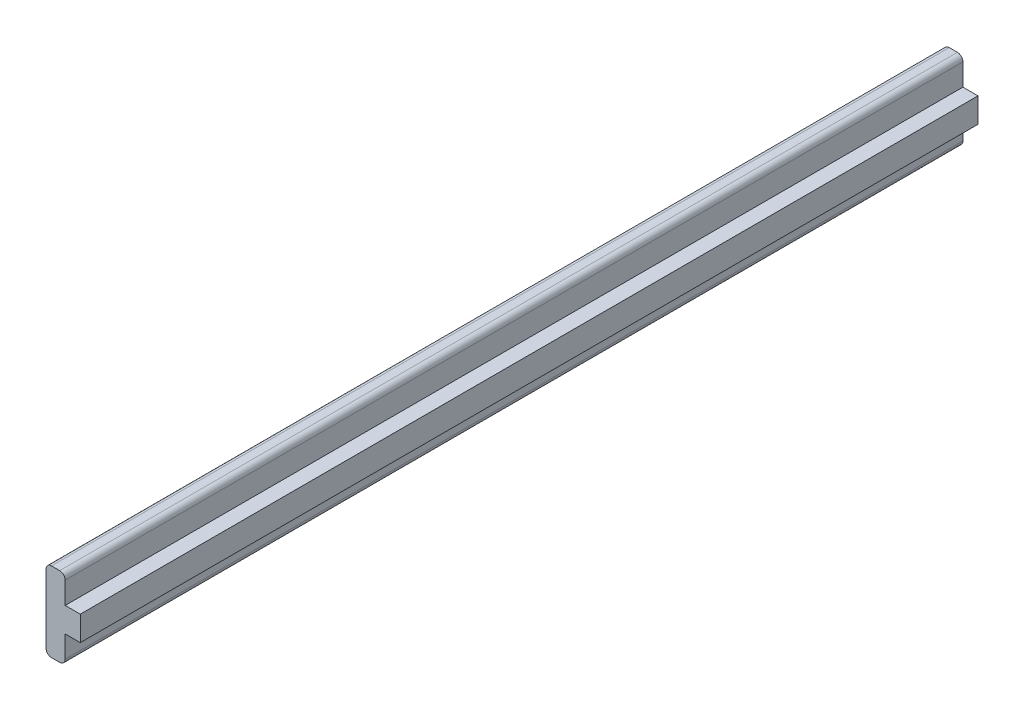
ISO-10303-21;
HEADER;
FILE_DESCRIPTION(('STEP AP214'),'2;1');
FILE_NAME('part.step','',(''),(''),'','','');
FILE_SCHEMA(('AUTOMOTIVE_DESIGN { 1 0 10303 214 1 1 1 1 }'));
ENDSEC;
DATA;
#1=APPLICATION_CONTEXT('core data for automotive mechanical design processes');
#2=APPLICATION_PROTOCOL_DEFINITION('international standard','automotive_design',2000,#1);
#3=PRODUCT_CONTEXT('',#1,'mechanical');
#4=PRODUCT('Part','Part','',(#3));
#5=PRODUCT_RELATED_PRODUCT_CATEGORY('part','',(#4));
#6=PRODUCT_DEFINITION_FORMATION('','',#4);
#7=PRODUCT_DEFINITION_CONTEXT('part definition',#1,'design');
#8=PRODUCT_DEFINITION('design','',#6,#7);
#9=PRODUCT_DEFINITION_SHAPE('','',#8);
#10=(LENGTH_UNIT() NAMED_UNIT(*) SI_UNIT(.MILLI.,.METRE.));
#11=(NAMED_UNIT(*) PLANE_ANGLE_UNIT() SI_UNIT($,.RADIAN.));
#12=(NAMED_UNIT(*) SI_UNIT($,.STERADIAN.) SOLID_ANGLE_UNIT());
#13=UNCERTAINTY_MEASURE_WITH_UNIT(LENGTH_MEASURE(1.E-05),#10,'distance_accuracy_value','');
#14=(GEOMETRIC_REPRESENTATION_CONTEXT(3) GLOBAL_UNCERTAINTY_ASSIGNED_CONTEXT((#13)) GLOBAL_UNIT_ASSIGNED_CONTEXT((#10,
#11,#12)) REPRESENTATION_CONTEXT('',''));
#15=CARTESIAN_POINT('',(0.,0.,0.));
#16=DIRECTION('',(0.,0.,1.));
#17=DIRECTION('',(1.,0.,0.));
#18=AXIS2_PLACEMENT_3D('',#15,#16,#17);
#19=CARTESIAN_POINT('',(-1.5,-4.,21.));
#20=DIRECTION('',(1.,0.,0.));
#21=DIRECTION('',(0.,0.,-1.));
#22=AXIS2_PLACEMENT_3D('',#19,#20,#21);
#23=PLANE('',#22);
#24=DIRECTION('',(0.,-1.,0.));
#25=VECTOR('',#24,1.);
#26=CARTESIAN_POINT('',(-1.5,-4.,16.5));
#27=LINE('',#26,#25);
#28=CARTESIAN_POINT('',(-1.5,1.5,16.5));
#29=VERTEX_POINT('',#28);
#30=CARTESIAN_POINT('',(-1.5,-3.5,16.5));
#31=VERTEX_POINT('',#30);
#32=EDGE_CURVE('E160',#29,#31,#27,.T.);
#33=ORIENTED_EDGE('',*,*,#32,.F.);
#34=DIRECTION('',(0.,0.,1.));
#35=VECTOR('',#34,1.);
#36=CARTESIAN_POINT('',(-1.5,1.5,21.));
#37=LINE('',#36,#35);
#38=CARTESIAN_POINT('',(-1.5,1.5,-49.));
#39=VERTEX_POINT('',#38);
#40=EDGE_CURVE('E195',#29,#39,#37,.F.);
#41=ORIENTED_EDGE('',*,*,#40,.T.);
#42=DIRECTION('',(0.,1.,0.));
#43=VECTOR('',#42,1.);
#44=CARTESIAN_POINT('',(-1.5,-3.9,-49.));
#45=LINE('',#44,#43);
#46=CARTESIAN_POINT('',(-1.5,-3.5,-49.));
#47=VERTEX_POINT('',#46);
#48=EDGE_CURVE('E175',#47,#39,#45,.T.);
#49=ORIENTED_EDGE('',*,*,#48,.F.);
#50=DIRECTION('',(0.,0.,1.));
#51=VECTOR('',#50,1.);
#52=CARTESIAN_POINT('',(-1.5,-3.5,21.));
#53=LINE('',#52,#51);
#54=EDGE_CURVE('E192',#47,#31,#53,.T.);
#55=ORIENTED_EDGE('',*,*,#54,.T.);
#56=EDGE_LOOP('',(#33,#41,#49,#55));
#57=FACE_BOUND('',#56,.T.);
#58=ADVANCED_FACE('F39',(#57),#23,.F.);
#59=CARTESIAN_POINT('',(-1.5,-3.9,0.));
#60=DIRECTION('',(0.,1.,0.));
#61=DIRECTION('',(0.,0.,1.));
#62=AXIS2_PLACEMENT_3D('',#59,#60,#61);
#63=PLANE('',#62);
#64=DIRECTION('',(1.,0.,0.));
#65=VECTOR('',#64,1.);
#66=CARTESIAN_POINT('',(-1.5,-3.9,16.5));
#67=LINE('',#66,#65);
#68=CARTESIAN_POINT('',(-1.1,-3.9,16.5));
#69=VERTEX_POINT('',#68);
#70=CARTESIAN_POINT('',(-0.5,-3.9,16.5));
#71=VERTEX_POINT('',#70);
#72=EDGE_CURVE('E158',#69,#71,#67,.T.);
#73=ORIENTED_EDGE('',*,*,#72,.F.);
#74=DIRECTION('',(0.,0.,1.));
#75=VECTOR('',#74,1.);
#76=CARTESIAN_POINT('',(-1.1,-3.9,0.));
#77=LINE('',#76,#75);
#78=CARTESIAN_POINT('',(-1.1,-3.9,-49.));
#79=VERTEX_POINT('',#78);
#80=EDGE_CURVE('E210',#69,#79,#77,.F.);
#81=ORIENTED_EDGE('',*,*,#80,.T.);
#82=DIRECTION('',(-1.,0.,0.));
#83=VECTOR('',#82,1.);
#84=CARTESIAN_POINT('',(-0.1,-3.9,-49.));
#85=LINE('',#84,#83);
#86=CARTESIAN_POINT('',(-0.5,-3.9,-49.));
#87=VERTEX_POINT('',#86);
#88=EDGE_CURVE('E172',#87,#79,#85,.T.);
#89=ORIENTED_EDGE('',*,*,#88,.F.);
#90=DIRECTION('',(0.,0.,1.));
#91=VECTOR('',#90,1.);
#92=CARTESIAN_POINT('',(-0.5,-3.9,0.));
#93=LINE('',#92,#91);
#94=EDGE_CURVE('E207',#87,#71,#93,.T.);
#95=ORIENTED_EDGE('',*,*,#94,.T.);
#96=EDGE_LOOP('',(#73,#81,#89,#95));
#97=FACE_BOUND('',#96,.T.);
#98=ADVANCED_FACE('F222',(#97),#63,.F.);
#99=CARTESIAN_POINT('',(-0.1,-3.9,0.));
#100=DIRECTION('',(-1.,0.,0.));
#101=DIRECTION('',(0.,-1.,0.));
#102=AXIS2_PLACEMENT_3D('',#99,#100,#101);
#103=PLANE('',#102);
#104=DIRECTION('',(0.,1.,0.));
#105=VECTOR('',#104,1.);
#106=CARTESIAN_POINT('',(-0.1,-3.9,16.5));
#107=LINE('',#106,#105);
#108=CARTESIAN_POINT('',(-0.1,-3.5,16.5));
#109=VERTEX_POINT('',#108);
#110=CARTESIAN_POINT('',(-0.0999999999999998,-1.9,16.5));
#111=VERTEX_POINT('',#110);
#112=EDGE_CURVE('E144',#109,#111,#107,.T.);
#113=ORIENTED_EDGE('',*,*,#112,.F.);
#114=DIRECTION('',(0.,0.,1.));
#115=VECTOR('',#114,1.);
#116=CARTESIAN_POINT('',(-0.1,-3.5,0.));
#117=LINE('',#116,#115);
#118=CARTESIAN_POINT('',(-0.1,-3.5,-49.));
#119=VERTEX_POINT('',#118);
#120=EDGE_CURVE('E47',#109,#119,#117,.F.);
#121=ORIENTED_EDGE('',*,*,#120,.T.);
#122=DIRECTION('',(0.,-1.,0.));
#123=VECTOR('',#122,1.);
#124=CARTESIAN_POINT('',(-0.0999999999999998,-1.9,-49.));
#125=LINE('',#124,#123);
#126=CARTESIAN_POINT('',(-0.0999999999999998,-1.9,-49.));
#127=VERTEX_POINT('',#126);
#128=EDGE_CURVE('E169',#127,#119,#125,.T.);
#129=ORIENTED_EDGE('',*,*,#128,.F.);
#130=DIRECTION('',(0.,0.,1.));
#131=VECTOR('',#130,1.);
#132=CARTESIAN_POINT('',(-0.0999999999999998,-1.9,0.));
#133=LINE('',#132,#131);
#134=EDGE_CURVE('E182',#127,#111,#133,.T.);
#135=ORIENTED_EDGE('',*,*,#134,.T.);
#136=EDGE_LOOP('',(#113,#121,#129,#135));
#137=FACE_BOUND('',#136,.T.);
#138=ADVANCED_FACE('F214',(#137),#103,.F.);
#139=CARTESIAN_POINT('',(-0.0999999999999998,-1.9,0.));
#140=DIRECTION('',(0.,1.,0.));
#141=DIRECTION('',(0.,0.,1.));
#142=AXIS2_PLACEMENT_3D('',#139,#140,#141);
#143=PLANE('',#142);
#144=DIRECTION('',(-1.,0.,0.));
#145=VECTOR('',#144,1.);
#146=CARTESIAN_POINT('',(2.1,-1.9,-49.));
#147=LINE('',#146,#145);
#148=CARTESIAN_POINT('',(1.,-1.9,-49.));
#149=VERTEX_POINT('',#148);
#150=EDGE_CURVE('E139',#149,#127,#147,.T.);
#151=ORIENTED_EDGE('',*,*,#150,.F.);
#152=DIRECTION('',(0.,0.,1.));
#153=VECTOR('',#152,1.);
#154=CARTESIAN_POINT('',(1.,-1.9,0.));
#155=LINE('',#154,#153);
#156=CARTESIAN_POINT('',(1.,-1.9,16.5));
#157=VERTEX_POINT('',#156);
#158=EDGE_CURVE('E127',#149,#157,#155,.T.);
#159=ORIENTED_EDGE('',*,*,#158,.T.);
#160=DIRECTION('',(1.,0.,0.));
#161=VECTOR('',#160,1.);
#162=CARTESIAN_POINT('',(-0.0999999999999998,-1.9,16.5));
#163=LINE('',#162,#161);
#164=EDGE_CURVE('E137',#111,#157,#163,.T.);
#165=ORIENTED_EDGE('',*,*,#164,.F.);
#166=ORIENTED_EDGE('',*,*,#134,.F.);
#167=EDGE_LOOP('',(#151,#159,#165,#166));
#168=FACE_BOUND('',#167,.T.);
#169=ADVANCED_FACE('F135',(#168),#143,.F.);
#170=CARTESIAN_POINT('',(-0.0999999999999998,-0.1,0.));
#171=DIRECTION('',(0.,-1.,0.));
#172=DIRECTION('',(0.,0.,-1.));
#173=AXIS2_PLACEMENT_3D('',#170,#171,#172);
#174=PLANE('',#173);
#175=DIRECTION('',(-1.,0.,0.));
#176=VECTOR('',#175,1.);
#177=CARTESIAN_POINT('',(-0.0999999999999998,-0.1,16.5));
#178=LINE('',#177,#176);
#179=CARTESIAN_POINT('',(1.,-0.1,16.5));
#180=VERTEX_POINT('',#179);
#181=CARTESIAN_POINT('',(-0.0999999999999998,-0.1,16.5));
#182=VERTEX_POINT('',#181);
#183=EDGE_CURVE('E140',#180,#182,#178,.T.);
#184=ORIENTED_EDGE('',*,*,#183,.F.);
#185=DIRECTION('',(0.,0.,-1.));
#186=VECTOR('',#185,1.);
#187=CARTESIAN_POINT('',(1.,-0.1,0.));
#188=LINE('',#187,#186);
#189=CARTESIAN_POINT('',(1.,-0.1,-49.));
#190=VERTEX_POINT('',#189);
#191=EDGE_CURVE('E53',#180,#190,#188,.T.);
#192=ORIENTED_EDGE('',*,*,#191,.T.);
#193=DIRECTION('',(1.,0.,0.));
#194=VECTOR('',#193,1.);
#195=CARTESIAN_POINT('',(-0.0999999999999998,-0.1,-49.));
#196=LINE('',#195,#194);
#197=CARTESIAN_POINT('',(-0.0999999999999998,-0.1,-49.));
#198=VERTEX_POINT('',#197);
#199=EDGE_CURVE('E165',#198,#190,#196,.T.);
#200=ORIENTED_EDGE('',*,*,#199,.F.);
#201=DIRECTION('',(0.,0.,1.));
#202=VECTOR('',#201,1.);
#203=CARTESIAN_POINT('',(-0.0999999999999998,-0.1,0.));
#204=LINE('',#203,#202);
#205=EDGE_CURVE('E183',#198,#182,#204,.T.);
#206=ORIENTED_EDGE('',*,*,#205,.T.);
#207=EDGE_LOOP('',(#184,#192,#200,#206));
#208=FACE_BOUND('',#207,.T.);
#209=ADVANCED_FACE('F253',(#208),#174,.F.);
#210=CARTESIAN_POINT('',(-0.1,1.9,0.));
#211=DIRECTION('',(-1.,0.,0.));
#212=DIRECTION('',(0.,-1.,0.));
#213=AXIS2_PLACEMENT_3D('',#210,#211,#212);
#214=PLANE('',#213);
#215=DIRECTION('',(0.,1.,0.));
#216=VECTOR('',#215,1.);
#217=CARTESIAN_POINT('',(-0.1,1.9,16.5));
#218=LINE('',#217,#216);
#219=CARTESIAN_POINT('',(-0.1,1.5,16.5));
#220=VERTEX_POINT('',#219);
#221=EDGE_CURVE('E249',#182,#220,#218,.T.);
#222=ORIENTED_EDGE('',*,*,#221,.F.);
#223=ORIENTED_EDGE('',*,*,#205,.F.);
#224=DIRECTION('',(0.,-1.,0.));
#225=VECTOR('',#224,1.);
#226=CARTESIAN_POINT('',(-0.1,1.9,-49.));
#227=LINE('',#226,#225);
#228=CARTESIAN_POINT('',(-0.1,1.5,-49.));
#229=VERTEX_POINT('',#228);
#230=EDGE_CURVE('E180',#229,#198,#227,.T.);
#231=ORIENTED_EDGE('',*,*,#230,.F.);
#232=DIRECTION('',(0.,0.,1.));
#233=VECTOR('',#232,1.);
#234=CARTESIAN_POINT('',(-0.1,1.5,0.));
#235=LINE('',#234,#233);
#236=EDGE_CURVE('E204',#229,#220,#235,.T.);
#237=ORIENTED_EDGE('',*,*,#236,.T.);
#238=EDGE_LOOP('',(#222,#223,#231,#237));
#239=FACE_BOUND('',#238,.T.);
#240=ADVANCED_FACE('F247',(#239),#214,.F.);
#241=CARTESIAN_POINT('',(-1.5,1.9,0.));
#242=DIRECTION('',(0.,-1.,0.));
#243=DIRECTION('',(0.,0.,-1.));
#244=AXIS2_PLACEMENT_3D('',#241,#242,#243);
#245=PLANE('',#244);
#246=DIRECTION('',(-1.,0.,0.));
#247=VECTOR('',#246,1.);
#248=CARTESIAN_POINT('',(-1.5,1.9,16.5));
#249=LINE('',#248,#247);
#250=CARTESIAN_POINT('',(-0.5,1.9,16.5));
#251=VERTEX_POINT('',#250);
#252=CARTESIAN_POINT('',(-1.1,1.9,16.5));
#253=VERTEX_POINT('',#252);
#254=EDGE_CURVE('E145',#251,#253,#249,.T.);
#255=ORIENTED_EDGE('',*,*,#254,.F.);
#256=DIRECTION('',(0.,0.,1.));
#257=VECTOR('',#256,1.);
#258=CARTESIAN_POINT('',(-0.5,1.9,0.));
#259=LINE('',#258,#257);
#260=CARTESIAN_POINT('',(-0.5,1.9,-49.));
#261=VERTEX_POINT('',#260);
#262=EDGE_CURVE('E186',#251,#261,#259,.F.);
#263=ORIENTED_EDGE('',*,*,#262,.T.);
#264=DIRECTION('',(1.,0.,0.));
#265=VECTOR('',#264,1.);
#266=CARTESIAN_POINT('',(-1.5,1.9,-49.));
#267=LINE('',#266,#265);
#268=CARTESIAN_POINT('',(-1.1,1.9,-49.));
#269=VERTEX_POINT('',#268);
#270=EDGE_CURVE('E178',#269,#261,#267,.T.);
#271=ORIENTED_EDGE('',*,*,#270,.F.);
#272=DIRECTION('',(0.,0.,1.));
#273=VECTOR('',#272,1.);
#274=CARTESIAN_POINT('',(-1.1,1.9,0.));
#275=LINE('',#274,#273);
#276=EDGE_CURVE('E189',#269,#253,#275,.T.);
#277=ORIENTED_EDGE('',*,*,#276,.T.);
#278=EDGE_LOOP('',(#255,#263,#271,#277));
#279=FACE_BOUND('',#278,.T.);
#280=ADVANCED_FACE('F239',(#279),#245,.F.);
#281=CARTESIAN_POINT('',(-1.1,1.5,0.));
#282=DIRECTION('',(0.,0.,1.));
#283=DIRECTION('',(1.,0.,0.));
#284=AXIS2_PLACEMENT_3D('',#281,#282,#283);
#285=CYLINDRICAL_SURFACE('',#284,0.4);
#286=ORIENTED_EDGE('',*,*,#40,.F.);
#287=CARTESIAN_POINT('',(-1.1,1.5,16.5));
#288=DIRECTION('',(0.,0.,1.));
#289=DIRECTION('',(1.,0.,0.));
#290=AXIS2_PLACEMENT_3D('',#287,#288,#289);
#291=CIRCLE('',#290,0.4);
#292=EDGE_CURVE('E155',#29,#253,#291,.F.);
#293=ORIENTED_EDGE('',*,*,#292,.T.);
#294=ORIENTED_EDGE('',*,*,#276,.F.);
#295=CARTESIAN_POINT('',(-1.1,1.5,-49.));
#296=DIRECTION('',(0.,0.,1.));
#297=DIRECTION('',(1.,0.,0.));
#298=AXIS2_PLACEMENT_3D('',#295,#296,#297);
#299=CIRCLE('',#298,0.4);
#300=EDGE_CURVE('E202',#39,#269,#299,.F.);
#301=ORIENTED_EDGE('',*,*,#300,.F.);
#302=EDGE_LOOP('',(#286,#293,#294,#301));
#303=FACE_BOUND('',#302,.T.);
#304=ADVANCED_FACE('F236',(#303),#285,.T.);
#305=CARTESIAN_POINT('',(-0.5,1.5,0.));
#306=DIRECTION('',(0.,0.,1.));
#307=DIRECTION('',(1.,0.,0.));
#308=AXIS2_PLACEMENT_3D('',#305,#306,#307);
#309=CYLINDRICAL_SURFACE('',#308,0.4);
#310=ORIENTED_EDGE('',*,*,#262,.F.);
#311=CARTESIAN_POINT('',(-0.5,1.5,16.5));
#312=DIRECTION('',(0.,0.,1.));
#313=DIRECTION('',(1.,0.,0.));
#314=AXIS2_PLACEMENT_3D('',#311,#312,#313);
#315=CIRCLE('',#314,0.4);
#316=EDGE_CURVE('E149',#251,#220,#315,.F.);
#317=ORIENTED_EDGE('',*,*,#316,.T.);
#318=ORIENTED_EDGE('',*,*,#236,.F.);
#319=CARTESIAN_POINT('',(-0.5,1.5,-49.));
#320=DIRECTION('',(0.,0.,1.));
#321=DIRECTION('',(1.,0.,0.));
#322=AXIS2_PLACEMENT_3D('',#319,#320,#321);
#323=CIRCLE('',#322,0.4);
#324=EDGE_CURVE('E61',#261,#229,#323,.F.);
#325=ORIENTED_EDGE('',*,*,#324,.F.);
#326=EDGE_LOOP('',(#310,#317,#318,#325));
#327=FACE_BOUND('',#326,.T.);
#328=ADVANCED_FACE('F243',(#327),#309,.T.);
#329=CARTESIAN_POINT('',(-1.1,-3.5,21.));
#330=DIRECTION('',(0.,0.,1.));
#331=DIRECTION('',(1.,0.,0.));
#332=AXIS2_PLACEMENT_3D('',#329,#330,#331);
#333=CYLINDRICAL_SURFACE('',#332,0.4);
#334=ORIENTED_EDGE('',*,*,#80,.F.);
#335=CARTESIAN_POINT('',(-1.1,-3.5,16.5));
#336=DIRECTION('',(0.,0.,1.));
#337=DIRECTION('',(1.,0.,0.));
#338=AXIS2_PLACEMENT_3D('',#335,#336,#337);
#339=CIRCLE('',#338,0.4);
#340=EDGE_CURVE('E162',#69,#31,#339,.F.);
#341=ORIENTED_EDGE('',*,*,#340,.T.);
#342=ORIENTED_EDGE('',*,*,#54,.F.);
#343=CARTESIAN_POINT('',(-1.1,-3.5,-49.));
#344=DIRECTION('',(0.,0.,1.));
#345=DIRECTION('',(1.,0.,0.));
#346=AXIS2_PLACEMENT_3D('',#343,#344,#345);
#347=CIRCLE('',#346,0.4);
#348=EDGE_CURVE('E199',#79,#47,#347,.F.);
#349=ORIENTED_EDGE('',*,*,#348,.F.);
#350=EDGE_LOOP('',(#334,#341,#342,#349));
#351=FACE_BOUND('',#350,.T.);
#352=ADVANCED_FACE('F228',(#351),#333,.T.);
#353=CARTESIAN_POINT('',(-0.5,-3.5,0.));
#354=DIRECTION('',(0.,0.,1.));
#355=DIRECTION('',(1.,0.,0.));
#356=AXIS2_PLACEMENT_3D('',#353,#354,#355);
#357=CYLINDRICAL_SURFACE('',#356,0.4);
#358=ORIENTED_EDGE('',*,*,#120,.F.);
#359=CARTESIAN_POINT('',(-0.5,-3.5,16.5));
#360=DIRECTION('',(0.,0.,1.));
#361=DIRECTION('',(1.,0.,0.));
#362=AXIS2_PLACEMENT_3D('',#359,#360,#361);
#363=CIRCLE('',#362,0.4);
#364=EDGE_CURVE('E147',#109,#71,#363,.F.);
#365=ORIENTED_EDGE('',*,*,#364,.T.);
#366=ORIENTED_EDGE('',*,*,#94,.F.);
#367=CARTESIAN_POINT('',(-0.5,-3.5,-49.));
#368=DIRECTION('',(0.,0.,1.));
#369=DIRECTION('',(1.,0.,0.));
#370=AXIS2_PLACEMENT_3D('',#367,#368,#369);
#371=CIRCLE('',#370,0.4);
#372=EDGE_CURVE('E197',#119,#87,#371,.F.);
#373=ORIENTED_EDGE('',*,*,#372,.F.);
#374=EDGE_LOOP('',(#358,#365,#366,#373));
#375=FACE_BOUND('',#374,.T.);
#376=ADVANCED_FACE('F41',(#375),#357,.T.);
#377=CARTESIAN_POINT('',(0.,0.,-49.));
#378=DIRECTION('',(0.,0.,1.));
#379=DIRECTION('',(1.,0.,0.));
#380=AXIS2_PLACEMENT_3D('',#377,#378,#379);
#381=PLANE('',#380);
#382=ORIENTED_EDGE('',*,*,#199,.T.);
#383=DIRECTION('',(0.,-1.,0.));
#384=VECTOR('',#383,1.);
#385=CARTESIAN_POINT('',(1.,2.64231624971699,-49.));
#386=LINE('',#385,#384);
#387=EDGE_CURVE('E251',#190,#149,#386,.T.);
#388=ORIENTED_EDGE('',*,*,#387,.T.);
#389=ORIENTED_EDGE('',*,*,#150,.T.);
#390=ORIENTED_EDGE('',*,*,#128,.T.);
#391=ORIENTED_EDGE('',*,*,#372,.T.);
#392=ORIENTED_EDGE('',*,*,#88,.T.);
#393=ORIENTED_EDGE('',*,*,#348,.T.);
#394=ORIENTED_EDGE('',*,*,#48,.T.);
#395=ORIENTED_EDGE('',*,*,#300,.T.);
#396=ORIENTED_EDGE('',*,*,#270,.T.);
#397=ORIENTED_EDGE('',*,*,#324,.T.);
#398=ORIENTED_EDGE('',*,*,#230,.T.);
#399=EDGE_LOOP('',(#382,#388,#389,#390,#391,#392,#393,#394,#395,#396,#397,#398));
#400=FACE_BOUND('',#399,.T.);
#401=ADVANCED_FACE('F217',(#400),#381,.F.);
#402=CARTESIAN_POINT('',(0.,0.,16.5));
#403=DIRECTION('',(0.,0.,1.));
#404=DIRECTION('',(1.,0.,0.));
#405=AXIS2_PLACEMENT_3D('',#402,#403,#404);
#406=PLANE('',#405);
#407=DIRECTION('',(0.,-1.,0.));
#408=VECTOR('',#407,1.);
#409=CARTESIAN_POINT('',(1.,0.,16.5));
#410=LINE('',#409,#408);
#411=EDGE_CURVE('E11',#180,#157,#410,.T.);
#412=ORIENTED_EDGE('',*,*,#411,.F.);
#413=ORIENTED_EDGE('',*,*,#183,.T.);
#414=ORIENTED_EDGE('',*,*,#221,.T.);
#415=ORIENTED_EDGE('',*,*,#316,.F.);
#416=ORIENTED_EDGE('',*,*,#254,.T.);
#417=ORIENTED_EDGE('',*,*,#292,.F.);
#418=ORIENTED_EDGE('',*,*,#32,.T.);
#419=ORIENTED_EDGE('',*,*,#340,.F.);
#420=ORIENTED_EDGE('',*,*,#72,.T.);
#421=ORIENTED_EDGE('',*,*,#364,.F.);
#422=ORIENTED_EDGE('',*,*,#112,.T.);
#423=ORIENTED_EDGE('',*,*,#164,.T.);
#424=EDGE_LOOP('',(#412,#413,#414,#415,#416,#417,#418,#419,#420,#421,#422,#423));
#425=FACE_BOUND('',#424,.T.);
#426=ADVANCED_FACE('F142',(#425),#406,.T.);
#427=CARTESIAN_POINT('',(1.,-0.1,-49.));
#428=DIRECTION('',(-1.,0.,0.));
#429=DIRECTION('',(0.,0.,1.));
#430=AXIS2_PLACEMENT_3D('',#427,#428,#429);
#431=PLANE('',#430);
#432=ORIENTED_EDGE('',*,*,#387,.F.);
#433=ORIENTED_EDGE('',*,*,#191,.F.);
#434=ORIENTED_EDGE('',*,*,#411,.T.);
#435=ORIENTED_EDGE('',*,*,#158,.F.);
#436=EDGE_LOOP('',(#432,#433,#434,#435));
#437=FACE_BOUND('',#436,.T.);
#438=ADVANCED_FACE('F126',(#437),#431,.F.);
#439=CLOSED_SHELL('',(#58,#98,#138,#169,#209,#240,#280,#304,#328,#352,#376,#401,#426,#438));
#440=MANIFOLD_SOLID_BREP('B2',#439);
#441=ADVANCED_BREP_SHAPE_REPRESENTATION('',(#18,#440),#14);
#442=SHAPE_DEFINITION_REPRESENTATION(#9,#441);
ENDSEC;
END-ISO-10303-21;
